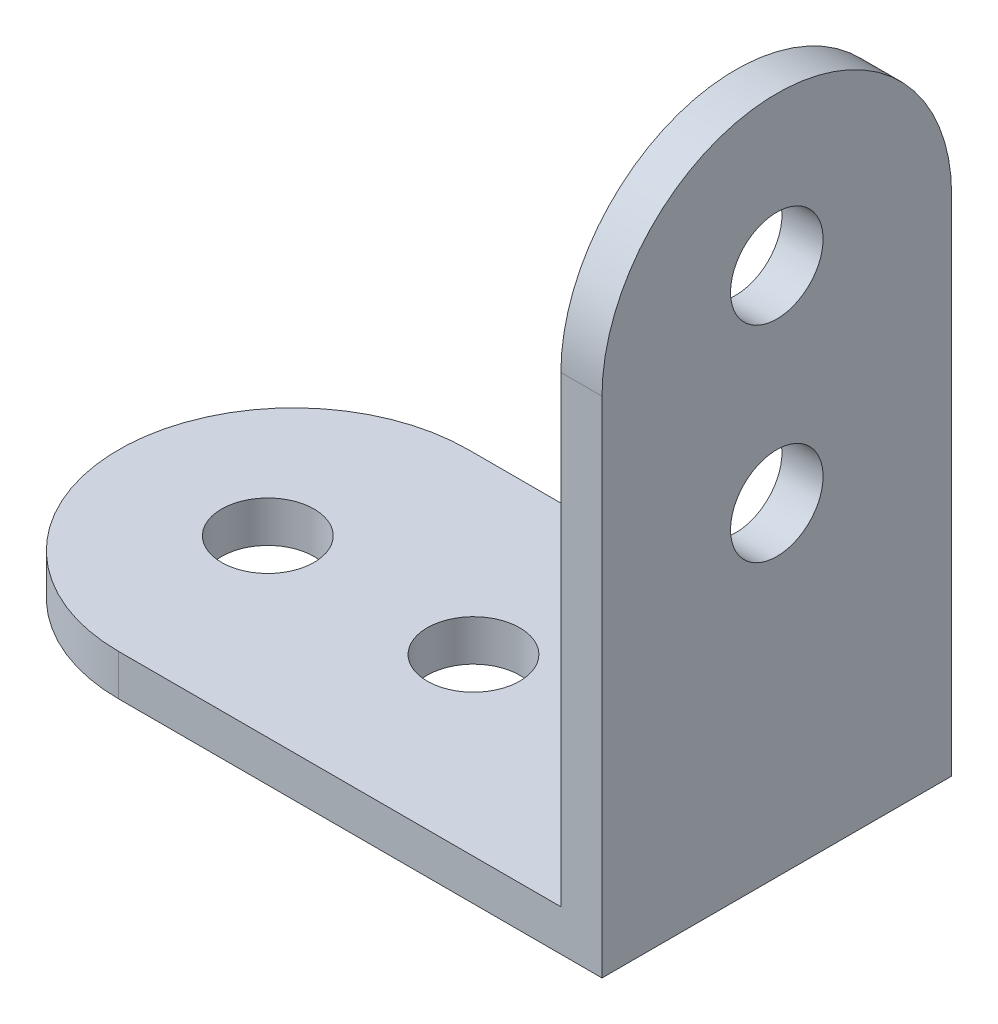
ISO-10303-21;
HEADER;
FILE_DESCRIPTION(('STEP AP214'),'2;1');
FILE_NAME('part.step','',(''),(''),'','','');
FILE_SCHEMA(('AUTOMOTIVE_DESIGN { 1 0 10303 214 1 1 1 1 }'));
ENDSEC;
DATA;
#1=APPLICATION_CONTEXT('core data for automotive mechanical design processes');
#2=APPLICATION_PROTOCOL_DEFINITION('international standard','automotive_design',2000,#1);
#3=PRODUCT_CONTEXT('',#1,'mechanical');
#4=PRODUCT('Part','Part','',(#3));
#5=PRODUCT_RELATED_PRODUCT_CATEGORY('part','',(#4));
#6=PRODUCT_DEFINITION_FORMATION('','',#4);
#7=PRODUCT_DEFINITION_CONTEXT('part definition',#1,'design');
#8=PRODUCT_DEFINITION('design','',#6,#7);
#9=PRODUCT_DEFINITION_SHAPE('','',#8);
#10=(LENGTH_UNIT() NAMED_UNIT(*) SI_UNIT(.MILLI.,.METRE.));
#11=(NAMED_UNIT(*) PLANE_ANGLE_UNIT() SI_UNIT($,.RADIAN.));
#12=(NAMED_UNIT(*) SI_UNIT($,.STERADIAN.) SOLID_ANGLE_UNIT());
#13=UNCERTAINTY_MEASURE_WITH_UNIT(LENGTH_MEASURE(1.E-05),#10,'distance_accuracy_value','');
#14=(GEOMETRIC_REPRESENTATION_CONTEXT(3) GLOBAL_UNCERTAINTY_ASSIGNED_CONTEXT((#13)) GLOBAL_UNIT_ASSIGNED_CONTEXT((#10,
#11,#12)) REPRESENTATION_CONTEXT('',''));
#15=CARTESIAN_POINT('',(0.,0.,0.));
#16=DIRECTION('',(0.,0.,1.));
#17=DIRECTION('',(1.,0.,0.));
#18=AXIS2_PLACEMENT_3D('',#15,#16,#17);
#19=CARTESIAN_POINT('',(0.,0.,17.));
#20=DIRECTION('',(0.,1.,0.));
#21=DIRECTION('',(0.,0.,1.));
#22=AXIS2_PLACEMENT_3D('',#19,#20,#21);
#23=PLANE('',#22);
#24=CARTESIAN_POINT('',(7.25,0.,8.5));
#25=DIRECTION('',(0.,1.,0.));
#26=DIRECTION('',(-1.,0.,0.));
#27=AXIS2_PLACEMENT_3D('',#24,#25,#26);
#28=CIRCLE('',#27,2.25);
#29=CARTESIAN_POINT('',(5.,0.,8.5));
#30=VERTEX_POINT('',#29);
#31=EDGE_CURVE('E125',#30,#30,#28,.T.);
#32=ORIENTED_EDGE('',*,*,#31,.T.);
#33=EDGE_LOOP('',(#32));
#34=FACE_BOUND('',#33,.T.);
#35=CARTESIAN_POINT('',(17.25,0.,8.5));
#36=DIRECTION('',(0.,1.,0.));
#37=DIRECTION('',(-1.,0.,0.));
#38=AXIS2_PLACEMENT_3D('',#35,#36,#37);
#39=CIRCLE('',#38,2.25);
#40=CARTESIAN_POINT('',(15.,0.,8.5));
#41=VERTEX_POINT('',#40);
#42=EDGE_CURVE('E136',#41,#41,#39,.T.);
#43=ORIENTED_EDGE('',*,*,#42,.T.);
#44=EDGE_LOOP('',(#43));
#45=FACE_BOUND('',#44,.T.);
#46=DIRECTION('',(1.,0.,0.));
#47=VECTOR('',#46,1.);
#48=CARTESIAN_POINT('',(0.,0.,17.));
#49=LINE('',#48,#47);
#50=CARTESIAN_POINT('',(8.5,0.,17.));
#51=VERTEX_POINT('',#50);
#52=CARTESIAN_POINT('',(32.,0.,17.));
#53=VERTEX_POINT('',#52);
#54=EDGE_CURVE('E90',#51,#53,#49,.T.);
#55=ORIENTED_EDGE('',*,*,#54,.F.);
#56=CARTESIAN_POINT('',(8.5,0.,8.5));
#57=DIRECTION('',(0.,1.,0.));
#58=DIRECTION('',(-1.,0.,0.));
#59=AXIS2_PLACEMENT_3D('',#56,#57,#58);
#60=CIRCLE('',#59,8.5);
#61=CARTESIAN_POINT('',(8.5,0.,0.));
#62=VERTEX_POINT('',#61);
#63=EDGE_CURVE('E112',#62,#51,#60,.T.);
#64=ORIENTED_EDGE('',*,*,#63,.F.);
#65=DIRECTION('',(1.,0.,0.));
#66=VECTOR('',#65,1.);
#67=CARTESIAN_POINT('',(0.,0.,0.));
#68=LINE('',#67,#66);
#69=CARTESIAN_POINT('',(32.,0.,0.));
#70=VERTEX_POINT('',#69);
#71=EDGE_CURVE('E97',#62,#70,#68,.T.);
#72=ORIENTED_EDGE('',*,*,#71,.T.);
#73=DIRECTION('',(0.,0.,-1.));
#74=VECTOR('',#73,1.);
#75=CARTESIAN_POINT('',(32.,0.,17.));
#76=LINE('',#75,#74);
#77=EDGE_CURVE('E11',#53,#70,#76,.T.);
#78=ORIENTED_EDGE('',*,*,#77,.F.);
#79=EDGE_LOOP('',(#55,#64,#72,#78));
#80=FACE_BOUND('',#79,.T.);
#81=ADVANCED_FACE('F33',(#34,#45,#80),#23,.F.);
#82=CARTESIAN_POINT('',(30.,2.,17.));
#83=DIRECTION('',(0.,-1.,0.));
#84=DIRECTION('',(1.,0.,0.));
#85=AXIS2_PLACEMENT_3D('',#82,#83,#84);
#86=PLANE('',#85);
#87=CARTESIAN_POINT('',(7.25,2.,8.5));
#88=DIRECTION('',(0.,1.,0.));
#89=DIRECTION('',(-1.,0.,0.));
#90=AXIS2_PLACEMENT_3D('',#87,#88,#89);
#91=CIRCLE('',#90,2.25);
#92=CARTESIAN_POINT('',(5.,2.,8.5));
#93=VERTEX_POINT('',#92);
#94=EDGE_CURVE('E139',#93,#93,#91,.T.);
#95=ORIENTED_EDGE('',*,*,#94,.F.);
#96=EDGE_LOOP('',(#95));
#97=FACE_BOUND('',#96,.T.);
#98=CARTESIAN_POINT('',(17.25,2.,8.5));
#99=DIRECTION('',(0.,1.,0.));
#100=DIRECTION('',(-1.,0.,0.));
#101=AXIS2_PLACEMENT_3D('',#98,#99,#100);
#102=CIRCLE('',#101,2.25);
#103=CARTESIAN_POINT('',(15.,2.,8.5));
#104=VERTEX_POINT('',#103);
#105=EDGE_CURVE('E133',#104,#104,#102,.T.);
#106=ORIENTED_EDGE('',*,*,#105,.F.);
#107=EDGE_LOOP('',(#106));
#108=FACE_BOUND('',#107,.T.);
#109=CARTESIAN_POINT('',(8.5,2.,8.5));
#110=DIRECTION('',(0.,1.,0.));
#111=DIRECTION('',(-1.,0.,0.));
#112=AXIS2_PLACEMENT_3D('',#109,#110,#111);
#113=CIRCLE('',#112,8.5);
#114=CARTESIAN_POINT('',(8.5,2.,0.));
#115=VERTEX_POINT('',#114);
#116=CARTESIAN_POINT('',(8.5,2.,17.));
#117=VERTEX_POINT('',#116);
#118=EDGE_CURVE('E113',#115,#117,#113,.T.);
#119=ORIENTED_EDGE('',*,*,#118,.T.);
#120=DIRECTION('',(-1.,0.,0.));
#121=VECTOR('',#120,1.);
#122=CARTESIAN_POINT('',(30.,2.,17.));
#123=LINE('',#122,#121);
#124=CARTESIAN_POINT('',(30.,2.,17.));
#125=VERTEX_POINT('',#124);
#126=EDGE_CURVE('E84',#125,#117,#123,.T.);
#127=ORIENTED_EDGE('',*,*,#126,.F.);
#128=DIRECTION('',(0.,0.,-1.));
#129=VECTOR('',#128,1.);
#130=CARTESIAN_POINT('',(30.,2.,17.));
#131=LINE('',#130,#129);
#132=CARTESIAN_POINT('',(30.,2.,0.));
#133=VERTEX_POINT('',#132);
#134=EDGE_CURVE('E40',#125,#133,#131,.T.);
#135=ORIENTED_EDGE('',*,*,#134,.T.);
#136=DIRECTION('',(-1.,0.,0.));
#137=VECTOR('',#136,1.);
#138=CARTESIAN_POINT('',(30.,2.,0.));
#139=LINE('',#138,#137);
#140=EDGE_CURVE('E76',#133,#115,#139,.T.);
#141=ORIENTED_EDGE('',*,*,#140,.T.);
#142=EDGE_LOOP('',(#119,#127,#135,#141));
#143=FACE_BOUND('',#142,.T.);
#144=ADVANCED_FACE('F82',(#97,#108,#143),#86,.F.);
#145=CARTESIAN_POINT('',(32.,0.,17.));
#146=DIRECTION('',(-1.,0.,0.));
#147=DIRECTION('',(0.,0.,1.));
#148=AXIS2_PLACEMENT_3D('',#145,#146,#147);
#149=PLANE('',#148);
#150=CARTESIAN_POINT('',(32.,25.75,8.5));
#151=DIRECTION('',(-1.,0.,0.));
#152=DIRECTION('',(0.,-1.,0.));
#153=AXIS2_PLACEMENT_3D('',#150,#151,#152);
#154=CIRCLE('',#153,2.25);
#155=CARTESIAN_POINT('',(32.,23.5,8.5));
#156=VERTEX_POINT('',#155);
#157=EDGE_CURVE('E120',#156,#156,#154,.T.);
#158=ORIENTED_EDGE('',*,*,#157,.T.);
#159=EDGE_LOOP('',(#158));
#160=FACE_BOUND('',#159,.T.);
#161=CARTESIAN_POINT('',(32.,15.75,8.5));
#162=DIRECTION('',(-1.,0.,0.));
#163=DIRECTION('',(0.,-1.,0.));
#164=AXIS2_PLACEMENT_3D('',#161,#162,#163);
#165=CIRCLE('',#164,2.25);
#166=CARTESIAN_POINT('',(32.,13.5,8.5));
#167=VERTEX_POINT('',#166);
#168=EDGE_CURVE('E124',#167,#167,#165,.T.);
#169=ORIENTED_EDGE('',*,*,#168,.T.);
#170=EDGE_LOOP('',(#169));
#171=FACE_BOUND('',#170,.T.);
#172=DIRECTION('',(0.,1.,0.));
#173=VECTOR('',#172,1.);
#174=CARTESIAN_POINT('',(32.,0.,0.));
#175=LINE('',#174,#173);
#176=CARTESIAN_POINT('',(32.,24.5,0.));
#177=VERTEX_POINT('',#176);
#178=EDGE_CURVE('E77',#70,#177,#175,.T.);
#179=ORIENTED_EDGE('',*,*,#178,.T.);
#180=CARTESIAN_POINT('',(32.,24.5,8.5));
#181=DIRECTION('',(-1.,0.,0.));
#182=DIRECTION('',(0.,-1.,0.));
#183=AXIS2_PLACEMENT_3D('',#180,#181,#182);
#184=CIRCLE('',#183,8.5);
#185=CARTESIAN_POINT('',(32.,24.5,17.));
#186=VERTEX_POINT('',#185);
#187=EDGE_CURVE('E105',#186,#177,#184,.T.);
#188=ORIENTED_EDGE('',*,*,#187,.F.);
#189=DIRECTION('',(0.,1.,0.));
#190=VECTOR('',#189,1.);
#191=CARTESIAN_POINT('',(32.,0.,17.));
#192=LINE('',#191,#190);
#193=EDGE_CURVE('E92',#53,#186,#192,.T.);
#194=ORIENTED_EDGE('',*,*,#193,.F.);
#195=ORIENTED_EDGE('',*,*,#77,.T.);
#196=EDGE_LOOP('',(#179,#188,#194,#195));
#197=FACE_BOUND('',#196,.T.);
#198=ADVANCED_FACE('F156',(#160,#171,#197),#149,.F.);
#199=CARTESIAN_POINT('',(30.,33.,17.));
#200=DIRECTION('',(1.,0.,0.));
#201=DIRECTION('',(0.,1.,0.));
#202=AXIS2_PLACEMENT_3D('',#199,#200,#201);
#203=PLANE('',#202);
#204=CARTESIAN_POINT('',(30.,25.75,8.5));
#205=DIRECTION('',(-1.,0.,0.));
#206=DIRECTION('',(0.,-1.,0.));
#207=AXIS2_PLACEMENT_3D('',#204,#205,#206);
#208=CIRCLE('',#207,2.25);
#209=CARTESIAN_POINT('',(30.,23.5,8.5));
#210=VERTEX_POINT('',#209);
#211=EDGE_CURVE('E128',#210,#210,#208,.T.);
#212=ORIENTED_EDGE('',*,*,#211,.F.);
#213=EDGE_LOOP('',(#212));
#214=FACE_BOUND('',#213,.T.);
#215=CARTESIAN_POINT('',(30.,15.75,8.5));
#216=DIRECTION('',(-1.,0.,0.));
#217=DIRECTION('',(0.,-1.,0.));
#218=AXIS2_PLACEMENT_3D('',#215,#216,#217);
#219=CIRCLE('',#218,2.25);
#220=CARTESIAN_POINT('',(30.,13.5,8.5));
#221=VERTEX_POINT('',#220);
#222=EDGE_CURVE('E121',#221,#221,#219,.T.);
#223=ORIENTED_EDGE('',*,*,#222,.F.);
#224=EDGE_LOOP('',(#223));
#225=FACE_BOUND('',#224,.T.);
#226=CARTESIAN_POINT('',(30.,24.5,8.5));
#227=DIRECTION('',(-1.,0.,0.));
#228=DIRECTION('',(0.,-1.,0.));
#229=AXIS2_PLACEMENT_3D('',#226,#227,#228);
#230=CIRCLE('',#229,8.5);
#231=CARTESIAN_POINT('',(30.,24.5,17.));
#232=VERTEX_POINT('',#231);
#233=CARTESIAN_POINT('',(30.,24.5,0.));
#234=VERTEX_POINT('',#233);
#235=EDGE_CURVE('E47',#232,#234,#230,.T.);
#236=ORIENTED_EDGE('',*,*,#235,.T.);
#237=DIRECTION('',(0.,-1.,0.));
#238=VECTOR('',#237,1.);
#239=CARTESIAN_POINT('',(30.,33.,0.));
#240=LINE('',#239,#238);
#241=EDGE_CURVE('E68',#234,#133,#240,.T.);
#242=ORIENTED_EDGE('',*,*,#241,.T.);
#243=ORIENTED_EDGE('',*,*,#134,.F.);
#244=DIRECTION('',(0.,-1.,0.));
#245=VECTOR('',#244,1.);
#246=CARTESIAN_POINT('',(30.,33.,17.));
#247=LINE('',#246,#245);
#248=EDGE_CURVE('E55',#232,#125,#247,.T.);
#249=ORIENTED_EDGE('',*,*,#248,.F.);
#250=EDGE_LOOP('',(#236,#242,#243,#249));
#251=FACE_BOUND('',#250,.T.);
#252=ADVANCED_FACE('F70',(#214,#225,#251),#203,.F.);
#253=CARTESIAN_POINT('',(0.,0.,0.));
#254=DIRECTION('',(0.,0.,1.));
#255=DIRECTION('',(1.,0.,0.));
#256=AXIS2_PLACEMENT_3D('',#253,#254,#255);
#257=PLANE('',#256);
#258=ORIENTED_EDGE('',*,*,#71,.F.);
#259=DIRECTION('',(0.,1.,0.));
#260=VECTOR('',#259,1.);
#261=CARTESIAN_POINT('',(8.5,0.,0.));
#262=LINE('',#261,#260);
#263=EDGE_CURVE('E89',#62,#115,#262,.T.);
#264=ORIENTED_EDGE('',*,*,#263,.T.);
#265=ORIENTED_EDGE('',*,*,#140,.F.);
#266=ORIENTED_EDGE('',*,*,#241,.F.);
#267=DIRECTION('',(-1.,0.,0.));
#268=VECTOR('',#267,1.);
#269=CARTESIAN_POINT('',(32.,24.5,0.));
#270=LINE('',#269,#268);
#271=EDGE_CURVE('E107',#177,#234,#270,.T.);
#272=ORIENTED_EDGE('',*,*,#271,.F.);
#273=ORIENTED_EDGE('',*,*,#178,.F.);
#274=EDGE_LOOP('',(#258,#264,#265,#266,#272,#273));
#275=FACE_BOUND('',#274,.T.);
#276=ADVANCED_FACE('F87',(#275),#257,.F.);
#277=CARTESIAN_POINT('',(0.,0.,17.));
#278=DIRECTION('',(0.,0.,1.));
#279=DIRECTION('',(1.,0.,0.));
#280=AXIS2_PLACEMENT_3D('',#277,#278,#279);
#281=PLANE('',#280);
#282=DIRECTION('',(0.,1.,0.));
#283=VECTOR('',#282,1.);
#284=CARTESIAN_POINT('',(8.5,0.,17.));
#285=LINE('',#284,#283);
#286=EDGE_CURVE('E115',#51,#117,#285,.T.);
#287=ORIENTED_EDGE('',*,*,#286,.F.);
#288=ORIENTED_EDGE('',*,*,#54,.T.);
#289=ORIENTED_EDGE('',*,*,#193,.T.);
#290=DIRECTION('',(-1.,0.,0.));
#291=VECTOR('',#290,1.);
#292=CARTESIAN_POINT('',(32.,24.5,17.));
#293=LINE('',#292,#291);
#294=EDGE_CURVE('E99',#186,#232,#293,.T.);
#295=ORIENTED_EDGE('',*,*,#294,.T.);
#296=ORIENTED_EDGE('',*,*,#248,.T.);
#297=ORIENTED_EDGE('',*,*,#126,.T.);
#298=EDGE_LOOP('',(#287,#288,#289,#295,#296,#297));
#299=FACE_BOUND('',#298,.T.);
#300=ADVANCED_FACE('F200',(#299),#281,.T.);
#301=CARTESIAN_POINT('',(32.,24.5,8.5));
#302=DIRECTION('',(-1.,0.,0.));
#303=DIRECTION('',(0.,-1.,0.));
#304=AXIS2_PLACEMENT_3D('',#301,#302,#303);
#305=CYLINDRICAL_SURFACE('',#304,8.5);
#306=ORIENTED_EDGE('',*,*,#235,.F.);
#307=ORIENTED_EDGE('',*,*,#294,.F.);
#308=ORIENTED_EDGE('',*,*,#187,.T.);
#309=ORIENTED_EDGE('',*,*,#271,.T.);
#310=EDGE_LOOP('',(#306,#307,#308,#309));
#311=FACE_BOUND('',#310,.T.);
#312=ADVANCED_FACE('F208',(#311),#305,.T.);
#313=CARTESIAN_POINT('',(8.5,0.,8.5));
#314=DIRECTION('',(0.,1.,0.));
#315=DIRECTION('',(-1.,0.,0.));
#316=AXIS2_PLACEMENT_3D('',#313,#314,#315);
#317=CYLINDRICAL_SURFACE('',#316,8.5);
#318=ORIENTED_EDGE('',*,*,#118,.F.);
#319=ORIENTED_EDGE('',*,*,#263,.F.);
#320=ORIENTED_EDGE('',*,*,#63,.T.);
#321=ORIENTED_EDGE('',*,*,#286,.T.);
#322=EDGE_LOOP('',(#318,#319,#320,#321));
#323=FACE_BOUND('',#322,.T.);
#324=ADVANCED_FACE('F214',(#323),#317,.T.);
#325=CARTESIAN_POINT('',(32.,15.75,8.5));
#326=DIRECTION('',(-1.,0.,0.));
#327=DIRECTION('',(0.,-1.,0.));
#328=AXIS2_PLACEMENT_3D('',#325,#326,#327);
#329=CYLINDRICAL_SURFACE('',#328,2.25);
#330=ORIENTED_EDGE('',*,*,#168,.F.);
#331=EDGE_LOOP('',(#330));
#332=FACE_BOUND('',#331,.T.);
#333=ORIENTED_EDGE('',*,*,#222,.T.);
#334=EDGE_LOOP('',(#333));
#335=FACE_BOUND('',#334,.T.);
#336=ADVANCED_FACE('F167',(#332,#335),#329,.F.);
#337=CARTESIAN_POINT('',(32.,25.75,8.5));
#338=DIRECTION('',(-1.,0.,0.));
#339=DIRECTION('',(0.,-1.,0.));
#340=AXIS2_PLACEMENT_3D('',#337,#338,#339);
#341=CYLINDRICAL_SURFACE('',#340,2.25);
#342=ORIENTED_EDGE('',*,*,#157,.F.);
#343=EDGE_LOOP('',(#342));
#344=FACE_BOUND('',#343,.T.);
#345=ORIENTED_EDGE('',*,*,#211,.T.);
#346=EDGE_LOOP('',(#345));
#347=FACE_BOUND('',#346,.T.);
#348=ADVANCED_FACE('F161',(#344,#347),#341,.F.);
#349=CARTESIAN_POINT('',(17.25,0.,8.5));
#350=DIRECTION('',(0.,1.,0.));
#351=DIRECTION('',(-1.,0.,0.));
#352=AXIS2_PLACEMENT_3D('',#349,#350,#351);
#353=CYLINDRICAL_SURFACE('',#352,2.25);
#354=ORIENTED_EDGE('',*,*,#42,.F.);
#355=EDGE_LOOP('',(#354));
#356=FACE_BOUND('',#355,.T.);
#357=ORIENTED_EDGE('',*,*,#105,.T.);
#358=EDGE_LOOP('',(#357));
#359=FACE_BOUND('',#358,.T.);
#360=ADVANCED_FACE('F150',(#356,#359),#353,.F.);
#361=CARTESIAN_POINT('',(7.25,0.,8.5));
#362=DIRECTION('',(0.,1.,0.));
#363=DIRECTION('',(-1.,0.,0.));
#364=AXIS2_PLACEMENT_3D('',#361,#362,#363);
#365=CYLINDRICAL_SURFACE('',#364,2.25);
#366=ORIENTED_EDGE('',*,*,#31,.F.);
#367=EDGE_LOOP('',(#366));
#368=FACE_BOUND('',#367,.T.);
#369=ORIENTED_EDGE('',*,*,#94,.T.);
#370=EDGE_LOOP('',(#369));
#371=FACE_BOUND('',#370,.T.);
#372=ADVANCED_FACE('F147',(#368,#371),#365,.F.);
#373=CLOSED_SHELL('',(#81,#144,#198,#252,#276,#300,#312,#324,#336,#348,#360,#372));
#374=MANIFOLD_SOLID_BREP('B2',#373);
#375=ADVANCED_BREP_SHAPE_REPRESENTATION('',(#18,#374),#14);
#376=SHAPE_DEFINITION_REPRESENTATION(#9,#375);
ENDSEC;
END-ISO-10303-21;
